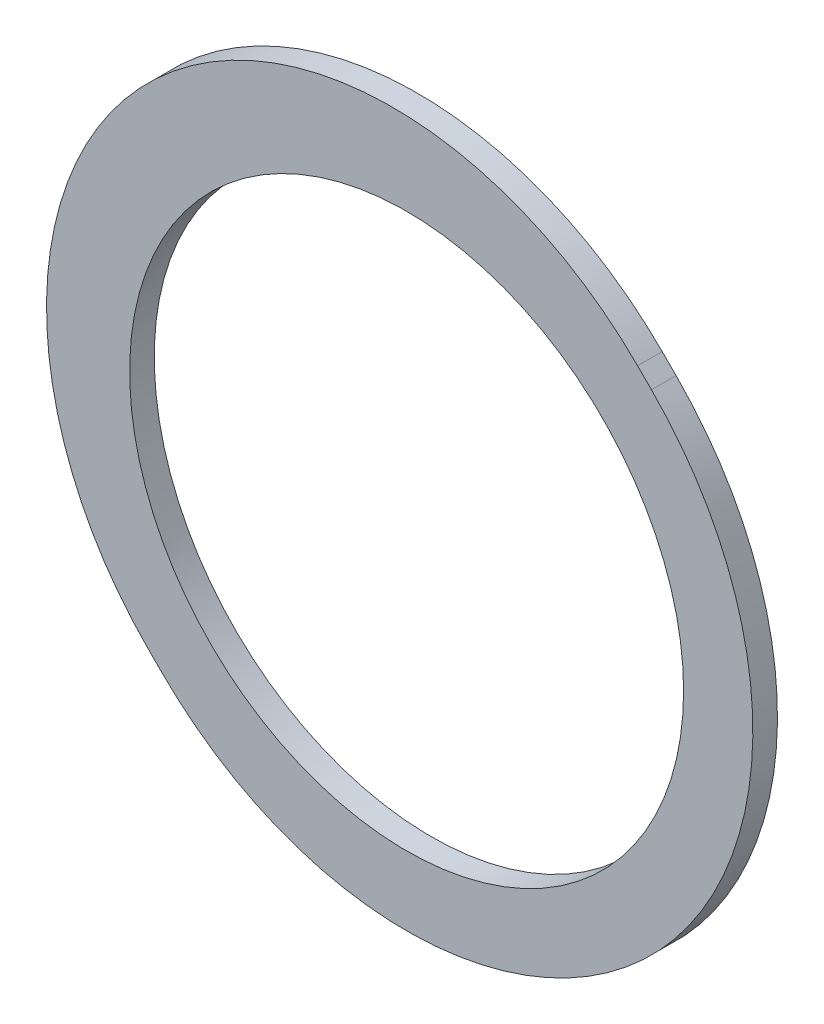
ISO-10303-21;
HEADER;
FILE_DESCRIPTION(('STEP AP214'),'2;1');
FILE_NAME('part.step','',(''),(''),'','','');
FILE_SCHEMA(('AUTOMOTIVE_DESIGN { 1 0 10303 214 1 1 1 1 }'));
ENDSEC;
DATA;
#1=APPLICATION_CONTEXT('core data for automotive mechanical design processes');
#2=APPLICATION_PROTOCOL_DEFINITION('international standard','automotive_design',2000,#1);
#3=PRODUCT_CONTEXT('',#1,'mechanical');
#4=PRODUCT('Part','Part','',(#3));
#5=PRODUCT_RELATED_PRODUCT_CATEGORY('part','',(#4));
#6=PRODUCT_DEFINITION_FORMATION('','',#4);
#7=PRODUCT_DEFINITION_CONTEXT('part definition',#1,'design');
#8=PRODUCT_DEFINITION('design','',#6,#7);
#9=PRODUCT_DEFINITION_SHAPE('','',#8);
#10=(LENGTH_UNIT() NAMED_UNIT(*) SI_UNIT(.MILLI.,.METRE.));
#11=(NAMED_UNIT(*) PLANE_ANGLE_UNIT() SI_UNIT($,.RADIAN.));
#12=(NAMED_UNIT(*) SI_UNIT($,.STERADIAN.) SOLID_ANGLE_UNIT());
#13=UNCERTAINTY_MEASURE_WITH_UNIT(LENGTH_MEASURE(1.E-05),#10,'distance_accuracy_value','');
#14=(GEOMETRIC_REPRESENTATION_CONTEXT(3) GLOBAL_UNCERTAINTY_ASSIGNED_CONTEXT((#13)) GLOBAL_UNIT_ASSIGNED_CONTEXT((#10,
#11,#12)) REPRESENTATION_CONTEXT('',''));
#15=CARTESIAN_POINT('',(0.,0.,0.));
#16=DIRECTION('',(0.,0.,1.));
#17=DIRECTION('',(1.,0.,0.));
#18=AXIS2_PLACEMENT_3D('',#15,#16,#17);
#19=CARTESIAN_POINT('',(57.04644928,62.26647694,0.));
#20=DIRECTION('',(0.707106781186422,0.707106781186673,0.));
#21=DIRECTION('',(0.707106781186673,-0.707106781186422,0.));
#22=AXIS2_PLACEMENT_3D('',#19,#20,#21);
#23=PLANE('',#22);
#24=DIRECTION('',(0.707106781186673,-0.707106781186422,0.));
#25=VECTOR('',#24,1.);
#26=CARTESIAN_POINT('',(57.04644928,62.26647694,0.03556));
#27=LINE('',#26,#25);
#28=CARTESIAN_POINT('',(57.04644928,62.26647694,0.03556));
#29=VERTEX_POINT('',#28);
#30=CARTESIAN_POINT('',(57.06644924,62.24647698,0.03556));
#31=VERTEX_POINT('',#30);
#32=EDGE_CURVE('E11',#29,#31,#27,.T.);
#33=ORIENTED_EDGE('',*,*,#32,.F.);
#34=DIRECTION('',(0.,0.,1.));
#35=VECTOR('',#34,1.);
#36=CARTESIAN_POINT('',(57.04644928,62.26647694,0.));
#37=LINE('',#36,#35);
#38=CARTESIAN_POINT('',(57.04644928,62.26647694,0.));
#39=VERTEX_POINT('',#38);
#40=EDGE_CURVE('E24',#39,#29,#37,.T.);
#41=ORIENTED_EDGE('',*,*,#40,.F.);
#42=DIRECTION('',(0.707106781186673,-0.707106781186422,0.));
#43=VECTOR('',#42,1.);
#44=CARTESIAN_POINT('',(57.04644928,62.26647694,0.));
#45=LINE('',#44,#43);
#46=CARTESIAN_POINT('',(57.06644924,62.24647698,0.));
#47=VERTEX_POINT('',#46);
#48=EDGE_CURVE('E96',#39,#47,#45,.T.);
#49=ORIENTED_EDGE('',*,*,#48,.T.);
#50=DIRECTION('',(0.,0.,1.));
#51=VECTOR('',#50,1.);
#52=CARTESIAN_POINT('',(57.06644924,62.24647698,0.));
#53=LINE('',#52,#51);
#54=EDGE_CURVE('E37',#47,#31,#53,.T.);
#55=ORIENTED_EDGE('',*,*,#54,.T.);
#56=EDGE_LOOP('',(#33,#41,#49,#55));
#57=FACE_BOUND('',#56,.T.);
#58=ADVANCED_FACE('F17',(#57),#23,.F.);
#59=CARTESIAN_POINT('',(57.40000204,62.6200297,0.));
#60=DIRECTION('',(0.,0.,-1.));
#61=DIRECTION('',(0.707106781186548,0.707106781186548,0.));
#62=AXIS2_PLACEMENT_3D('',#59,#60,#61);
#63=CYLINDRICAL_SURFACE('',#62,0.499999108206439);
#64=CARTESIAN_POINT('',(57.40000204,62.6200297,0.03556));
#65=DIRECTION('',(0.,0.,1.));
#66=DIRECTION('',(0.707106781186548,0.707106781186548,0.));
#67=AXIS2_PLACEMENT_3D('',#64,#65,#66);
#68=CIRCLE('',#67,0.499999108206439);
#69=CARTESIAN_POINT('',(57.7535548,62.97358246,0.03556));
#70=VERTEX_POINT('',#69);
#71=EDGE_CURVE('E92',#70,#29,#68,.T.);
#72=ORIENTED_EDGE('',*,*,#71,.F.);
#73=DIRECTION('',(0.,0.,1.));
#74=VECTOR('',#73,1.);
#75=CARTESIAN_POINT('',(57.7535548,62.97358246,0.));
#76=LINE('',#75,#74);
#77=CARTESIAN_POINT('',(57.7535548,62.97358246,0.));
#78=VERTEX_POINT('',#77);
#79=EDGE_CURVE('E90',#78,#70,#76,.T.);
#80=ORIENTED_EDGE('',*,*,#79,.F.);
#81=CARTESIAN_POINT('',(57.40000204,62.6200297,0.));
#82=DIRECTION('',(0.,0.,1.));
#83=DIRECTION('',(0.707106781186548,0.707106781186548,0.));
#84=AXIS2_PLACEMENT_3D('',#81,#82,#83);
#85=CIRCLE('',#84,0.499999108206439);
#86=EDGE_CURVE('E88',#78,#39,#85,.T.);
#87=ORIENTED_EDGE('',*,*,#86,.T.);
#88=ORIENTED_EDGE('',*,*,#40,.T.);
#89=EDGE_LOOP('',(#72,#80,#87,#88));
#90=FACE_BOUND('',#89,.T.);
#91=ADVANCED_FACE('F111',(#90),#63,.T.);
#92=CARTESIAN_POINT('',(57.420002,62.60002974,0.));
#93=DIRECTION('',(0.,0.,-1.));
#94=DIRECTION('',(-0.707106781186555,-0.70710678118654,0.));
#95=AXIS2_PLACEMENT_3D('',#92,#93,#94);
#96=CYLINDRICAL_SURFACE('',#95,0.499999108206436);
#97=CARTESIAN_POINT('',(57.420002,62.60002974,0.03556));
#98=DIRECTION('',(0.,0.,1.));
#99=DIRECTION('',(-0.707106781186555,-0.70710678118654,0.));
#100=AXIS2_PLACEMENT_3D('',#97,#98,#99);
#101=CIRCLE('',#100,0.499999108206436);
#102=CARTESIAN_POINT('',(57.77355476,62.9535825,0.03556));
#103=VERTEX_POINT('',#102);
#104=EDGE_CURVE('E85',#31,#103,#101,.T.);
#105=ORIENTED_EDGE('',*,*,#104,.F.);
#106=ORIENTED_EDGE('',*,*,#54,.F.);
#107=CARTESIAN_POINT('',(57.420002,62.60002974,0.));
#108=DIRECTION('',(0.,0.,1.));
#109=DIRECTION('',(-0.707106781186555,-0.70710678118654,0.));
#110=AXIS2_PLACEMENT_3D('',#107,#108,#109);
#111=CIRCLE('',#110,0.499999108206436);
#112=CARTESIAN_POINT('',(57.77355476,62.9535825,0.));
#113=VERTEX_POINT('',#112);
#114=EDGE_CURVE('E82',#47,#113,#111,.T.);
#115=ORIENTED_EDGE('',*,*,#114,.T.);
#116=DIRECTION('',(0.,0.,1.));
#117=VECTOR('',#116,1.);
#118=CARTESIAN_POINT('',(57.77355476,62.9535825,0.));
#119=LINE('',#118,#117);
#120=EDGE_CURVE('E80',#113,#103,#119,.T.);
#121=ORIENTED_EDGE('',*,*,#120,.T.);
#122=EDGE_LOOP('',(#105,#106,#115,#121));
#123=FACE_BOUND('',#122,.T.);
#124=ADVANCED_FACE('F104',(#123),#96,.T.);
#125=CARTESIAN_POINT('',(57.77355476,62.9535825,0.));
#126=DIRECTION('',(-0.707106781186548,-0.707106781186548,0.));
#127=DIRECTION('',(-0.707106781186548,0.707106781186548,0.));
#128=AXIS2_PLACEMENT_3D('',#125,#126,#127);
#129=PLANE('',#128);
#130=DIRECTION('',(-0.707106781186548,0.707106781186548,0.));
#131=VECTOR('',#130,1.);
#132=CARTESIAN_POINT('',(57.77355476,62.9535825,0.03556));
#133=LINE('',#132,#131);
#134=EDGE_CURVE('E77',#103,#70,#133,.T.);
#135=ORIENTED_EDGE('',*,*,#134,.F.);
#136=ORIENTED_EDGE('',*,*,#120,.F.);
#137=DIRECTION('',(-0.707106781186548,0.707106781186548,0.));
#138=VECTOR('',#137,1.);
#139=CARTESIAN_POINT('',(57.77355476,62.9535825,0.));
#140=LINE('',#139,#138);
#141=EDGE_CURVE('E68',#113,#78,#140,.T.);
#142=ORIENTED_EDGE('',*,*,#141,.T.);
#143=ORIENTED_EDGE('',*,*,#79,.T.);
#144=EDGE_LOOP('',(#135,#136,#142,#143));
#145=FACE_BOUND('',#144,.T.);
#146=ADVANCED_FACE('F110',(#145),#129,.F.);
#147=CARTESIAN_POINT('',(57.420002,62.6000272,0.));
#148=DIRECTION('',(0.,0.,-1.));
#149=DIRECTION('',(1.,0.,0.));
#150=AXIS2_PLACEMENT_3D('',#147,#148,#149);
#151=CYLINDRICAL_SURFACE('',#150,0.3999992);
#152=DIRECTION('',(0.,0.,1.));
#153=VECTOR('',#152,1.);
#154=CARTESIAN_POINT('',(57.8200012,62.6000272,0.));
#155=LINE('',#154,#153);
#156=CARTESIAN_POINT('',(57.8200012,62.6000272,0.));
#157=VERTEX_POINT('',#156);
#158=CARTESIAN_POINT('',(57.8200012,62.6000272,0.03556));
#159=VERTEX_POINT('',#158);
#160=EDGE_CURVE('E62',#157,#159,#155,.T.);
#161=ORIENTED_EDGE('',*,*,#160,.T.);
#162=CARTESIAN_POINT('',(57.420002,62.6000272,0.03556));
#163=DIRECTION('',(0.,0.,1.));
#164=DIRECTION('',(1.,0.,0.));
#165=AXIS2_PLACEMENT_3D('',#162,#163,#164);
#166=CIRCLE('',#165,0.3999992);
#167=EDGE_CURVE('E67',#159,#159,#166,.T.);
#168=ORIENTED_EDGE('',*,*,#167,.T.);
#169=ORIENTED_EDGE('',*,*,#160,.F.);
#170=CARTESIAN_POINT('',(57.420002,62.6000272,0.));
#171=DIRECTION('',(0.,0.,1.));
#172=DIRECTION('',(1.,0.,0.));
#173=AXIS2_PLACEMENT_3D('',#170,#171,#172);
#174=CIRCLE('',#173,0.3999992);
#175=EDGE_CURVE('E65',#157,#157,#174,.T.);
#176=ORIENTED_EDGE('',*,*,#175,.F.);
#177=EDGE_LOOP('',(#161,#168,#169,#176));
#178=FACE_BOUND('',#177,.T.);
#179=ADVANCED_FACE('F64',(#178),#151,.F.);
#180=CARTESIAN_POINT('',(57.04644928,62.26647694,0.));
#181=DIRECTION('',(0.,0.,-1.));
#182=DIRECTION('',(-1.,0.,0.));
#183=AXIS2_PLACEMENT_3D('',#180,#181,#182);
#184=PLANE('',#183);
#185=ORIENTED_EDGE('',*,*,#48,.F.);
#186=ORIENTED_EDGE('',*,*,#86,.F.);
#187=ORIENTED_EDGE('',*,*,#141,.F.);
#188=ORIENTED_EDGE('',*,*,#114,.F.);
#189=EDGE_LOOP('',(#185,#186,#187,#188));
#190=FACE_BOUND('',#189,.T.);
#191=ORIENTED_EDGE('',*,*,#175,.T.);
#192=EDGE_LOOP('',(#191));
#193=FACE_BOUND('',#192,.T.);
#194=ADVANCED_FACE('F71',(#190,#193),#184,.T.);
#195=CARTESIAN_POINT('',(57.04644928,62.26647694,0.03556));
#196=DIRECTION('',(0.,0.,-1.));
#197=DIRECTION('',(-1.,0.,0.));
#198=AXIS2_PLACEMENT_3D('',#195,#196,#197);
#199=PLANE('',#198);
#200=ORIENTED_EDGE('',*,*,#134,.T.);
#201=ORIENTED_EDGE('',*,*,#71,.T.);
#202=ORIENTED_EDGE('',*,*,#32,.T.);
#203=ORIENTED_EDGE('',*,*,#104,.T.);
#204=EDGE_LOOP('',(#200,#201,#202,#203));
#205=FACE_BOUND('',#204,.T.);
#206=ORIENTED_EDGE('',*,*,#167,.F.);
#207=EDGE_LOOP('',(#206));
#208=FACE_BOUND('',#207,.T.);
#209=ADVANCED_FACE('F107',(#205,#208),#199,.F.);
#210=CLOSED_SHELL('',(#58,#91,#124,#146,#179,#194,#209));
#211=MANIFOLD_SOLID_BREP('B1',#210);
#212=ADVANCED_BREP_SHAPE_REPRESENTATION('',(#18,#211),#14);
#213=SHAPE_DEFINITION_REPRESENTATION(#9,#212);
ENDSEC;
END-ISO-10303-21;
